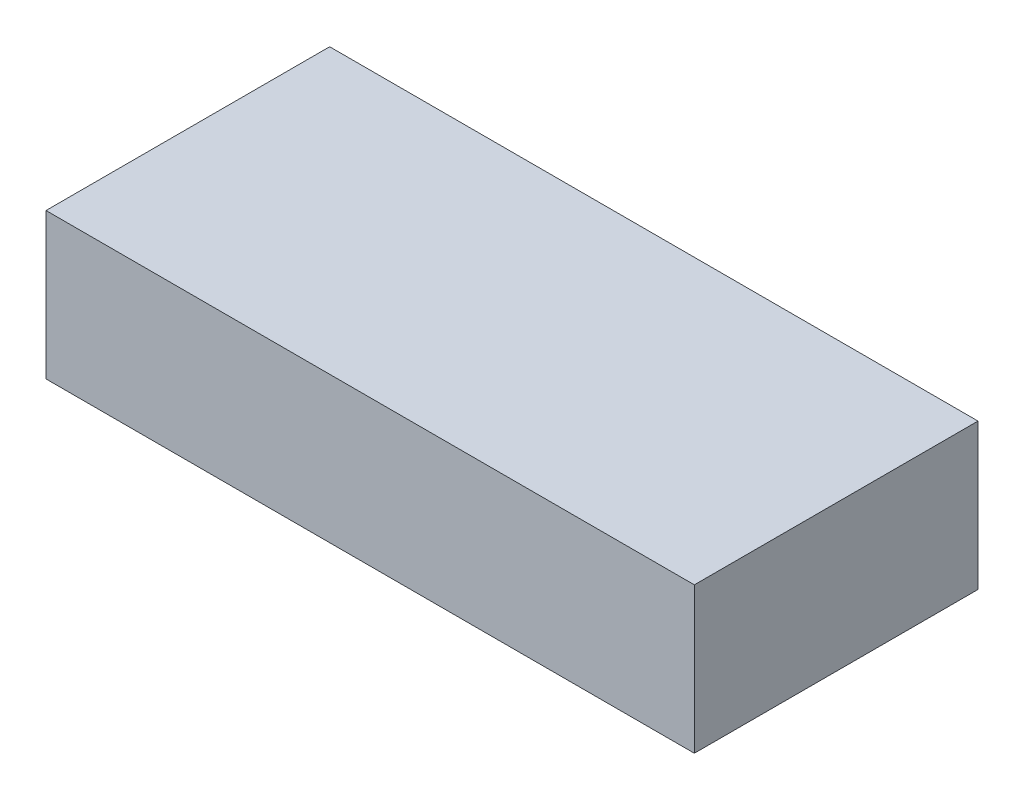
ISO-10303-21;
HEADER;
FILE_DESCRIPTION(('STEP AP214'),'2;1');
FILE_NAME('part.step','',(''),(''),'','','');
FILE_SCHEMA(('AUTOMOTIVE_DESIGN { 1 0 10303 214 1 1 1 1 }'));
ENDSEC;
DATA;
#1=APPLICATION_CONTEXT('core data for automotive mechanical design processes');
#2=APPLICATION_PROTOCOL_DEFINITION('international standard','automotive_design',2000,#1);
#3=PRODUCT_CONTEXT('',#1,'mechanical');
#4=PRODUCT('Part','Part','',(#3));
#5=PRODUCT_RELATED_PRODUCT_CATEGORY('part','',(#4));
#6=PRODUCT_DEFINITION_FORMATION('','',#4);
#7=PRODUCT_DEFINITION_CONTEXT('part definition',#1,'design');
#8=PRODUCT_DEFINITION('design','',#6,#7);
#9=PRODUCT_DEFINITION_SHAPE('','',#8);
#10=(LENGTH_UNIT() NAMED_UNIT(*) SI_UNIT(.MILLI.,.METRE.));
#11=(NAMED_UNIT(*) PLANE_ANGLE_UNIT() SI_UNIT($,.RADIAN.));
#12=(NAMED_UNIT(*) SI_UNIT($,.STERADIAN.) SOLID_ANGLE_UNIT());
#13=UNCERTAINTY_MEASURE_WITH_UNIT(LENGTH_MEASURE(1.E-05),#10,'distance_accuracy_value','');
#14=(GEOMETRIC_REPRESENTATION_CONTEXT(3) GLOBAL_UNCERTAINTY_ASSIGNED_CONTEXT((#13)) GLOBAL_UNIT_ASSIGNED_CONTEXT((#10,
#11,#12)) REPRESENTATION_CONTEXT('',''));
#15=CARTESIAN_POINT('',(0.,0.,0.));
#16=DIRECTION('',(0.,0.,1.));
#17=DIRECTION('',(1.,0.,0.));
#18=AXIS2_PLACEMENT_3D('',#15,#16,#17);
#19=CARTESIAN_POINT('',(-40.,18.,17.5));
#20=DIRECTION('',(1.,0.,0.));
#21=DIRECTION('',(0.,0.,-1.));
#22=AXIS2_PLACEMENT_3D('',#19,#20,#21);
#23=PLANE('',#22);
#24=DIRECTION('',(0.,0.,1.));
#25=VECTOR('',#24,1.);
#26=CARTESIAN_POINT('',(-40.,0.,17.5));
#27=LINE('',#26,#25);
#28=CARTESIAN_POINT('',(-40.,0.,-17.5));
#29=VERTEX_POINT('',#28);
#30=CARTESIAN_POINT('',(-40.,0.,17.5));
#31=VERTEX_POINT('',#30);
#32=EDGE_CURVE('E96',#29,#31,#27,.T.);
#33=ORIENTED_EDGE('',*,*,#32,.T.);
#34=DIRECTION('',(0.,-1.,0.));
#35=VECTOR('',#34,1.);
#36=CARTESIAN_POINT('',(-40.,18.,17.5));
#37=LINE('',#36,#35);
#38=CARTESIAN_POINT('',(-40.,18.,17.5));
#39=VERTEX_POINT('',#38);
#40=EDGE_CURVE('E11',#39,#31,#37,.T.);
#41=ORIENTED_EDGE('',*,*,#40,.F.);
#42=DIRECTION('',(0.,0.,1.));
#43=VECTOR('',#42,1.);
#44=CARTESIAN_POINT('',(-40.,18.,17.5));
#45=LINE('',#44,#43);
#46=CARTESIAN_POINT('',(-40.,18.,-17.5));
#47=VERTEX_POINT('',#46);
#48=EDGE_CURVE('E84',#47,#39,#45,.T.);
#49=ORIENTED_EDGE('',*,*,#48,.F.);
#50=DIRECTION('',(0.,-1.,0.));
#51=VECTOR('',#50,1.);
#52=CARTESIAN_POINT('',(-40.,18.,-17.5));
#53=LINE('',#52,#51);
#54=EDGE_CURVE('E92',#47,#29,#53,.T.);
#55=ORIENTED_EDGE('',*,*,#54,.T.);
#56=EDGE_LOOP('',(#33,#41,#49,#55));
#57=FACE_BOUND('',#56,.T.);
#58=ADVANCED_FACE('F33',(#57),#23,.F.);
#59=CARTESIAN_POINT('',(40.,18.,17.5));
#60=DIRECTION('',(0.,0.,-1.));
#61=DIRECTION('',(-1.,0.,0.));
#62=AXIS2_PLACEMENT_3D('',#59,#60,#61);
#63=PLANE('',#62);
#64=DIRECTION('',(1.,0.,0.));
#65=VECTOR('',#64,1.);
#66=CARTESIAN_POINT('',(40.,0.,17.5));
#67=LINE('',#66,#65);
#68=CARTESIAN_POINT('',(40.,0.,17.5));
#69=VERTEX_POINT('',#68);
#70=EDGE_CURVE('E88',#31,#69,#67,.T.);
#71=ORIENTED_EDGE('',*,*,#70,.T.);
#72=DIRECTION('',(0.,-1.,0.));
#73=VECTOR('',#72,1.);
#74=CARTESIAN_POINT('',(40.,18.,17.5));
#75=LINE('',#74,#73);
#76=CARTESIAN_POINT('',(40.,18.,17.5));
#77=VERTEX_POINT('',#76);
#78=EDGE_CURVE('E41',#77,#69,#75,.T.);
#79=ORIENTED_EDGE('',*,*,#78,.F.);
#80=DIRECTION('',(1.,0.,0.));
#81=VECTOR('',#80,1.);
#82=CARTESIAN_POINT('',(40.,18.,17.5));
#83=LINE('',#82,#81);
#84=EDGE_CURVE('E79',#39,#77,#83,.T.);
#85=ORIENTED_EDGE('',*,*,#84,.F.);
#86=ORIENTED_EDGE('',*,*,#40,.T.);
#87=EDGE_LOOP('',(#71,#79,#85,#86));
#88=FACE_BOUND('',#87,.T.);
#89=ADVANCED_FACE('F87',(#88),#63,.F.);
#90=CARTESIAN_POINT('',(40.,18.,17.5));
#91=DIRECTION('',(-1.,0.,0.));
#92=DIRECTION('',(0.,0.,1.));
#93=AXIS2_PLACEMENT_3D('',#90,#91,#92);
#94=PLANE('',#93);
#95=DIRECTION('',(0.,0.,-1.));
#96=VECTOR('',#95,1.);
#97=CARTESIAN_POINT('',(40.,0.,17.5));
#98=LINE('',#97,#96);
#99=CARTESIAN_POINT('',(40.,0.,-17.5));
#100=VERTEX_POINT('',#99);
#101=EDGE_CURVE('E66',#69,#100,#98,.T.);
#102=ORIENTED_EDGE('',*,*,#101,.T.);
#103=DIRECTION('',(0.,-1.,0.));
#104=VECTOR('',#103,1.);
#105=CARTESIAN_POINT('',(40.,18.,-17.5));
#106=LINE('',#105,#104);
#107=CARTESIAN_POINT('',(40.,18.,-17.5));
#108=VERTEX_POINT('',#107);
#109=EDGE_CURVE('E89',#108,#100,#106,.T.);
#110=ORIENTED_EDGE('',*,*,#109,.F.);
#111=DIRECTION('',(0.,0.,-1.));
#112=VECTOR('',#111,1.);
#113=CARTESIAN_POINT('',(40.,18.,17.5));
#114=LINE('',#113,#112);
#115=EDGE_CURVE('E82',#77,#108,#114,.T.);
#116=ORIENTED_EDGE('',*,*,#115,.F.);
#117=ORIENTED_EDGE('',*,*,#78,.T.);
#118=EDGE_LOOP('',(#102,#110,#116,#117));
#119=FACE_BOUND('',#118,.T.);
#120=ADVANCED_FACE('F90',(#119),#94,.F.);
#121=CARTESIAN_POINT('',(40.,18.,-17.5));
#122=DIRECTION('',(0.,0.,1.));
#123=DIRECTION('',(1.,0.,0.));
#124=AXIS2_PLACEMENT_3D('',#121,#122,#123);
#125=PLANE('',#124);
#126=DIRECTION('',(-1.,0.,0.));
#127=VECTOR('',#126,1.);
#128=CARTESIAN_POINT('',(40.,0.,-17.5));
#129=LINE('',#128,#127);
#130=EDGE_CURVE('E72',#100,#29,#129,.T.);
#131=ORIENTED_EDGE('',*,*,#130,.T.);
#132=ORIENTED_EDGE('',*,*,#54,.F.);
#133=DIRECTION('',(-1.,0.,0.));
#134=VECTOR('',#133,1.);
#135=CARTESIAN_POINT('',(40.,18.,-17.5));
#136=LINE('',#135,#134);
#137=EDGE_CURVE('E49',#108,#47,#136,.T.);
#138=ORIENTED_EDGE('',*,*,#137,.F.);
#139=ORIENTED_EDGE('',*,*,#109,.T.);
#140=EDGE_LOOP('',(#131,#132,#138,#139));
#141=FACE_BOUND('',#140,.T.);
#142=ADVANCED_FACE('F103',(#141),#125,.F.);
#143=CARTESIAN_POINT('',(0.,18.,0.));
#144=DIRECTION('',(0.,1.,0.));
#145=DIRECTION('',(0.,0.,1.));
#146=AXIS2_PLACEMENT_3D('',#143,#144,#145);
#147=PLANE('',#146);
#148=ORIENTED_EDGE('',*,*,#48,.T.);
#149=ORIENTED_EDGE('',*,*,#84,.T.);
#150=ORIENTED_EDGE('',*,*,#115,.T.);
#151=ORIENTED_EDGE('',*,*,#137,.T.);
#152=EDGE_LOOP('',(#148,#149,#150,#151));
#153=FACE_BOUND('',#152,.T.);
#154=ADVANCED_FACE('F80',(#153),#147,.T.);
#155=CARTESIAN_POINT('',(0.,0.,0.));
#156=DIRECTION('',(0.,1.,0.));
#157=DIRECTION('',(0.,0.,1.));
#158=AXIS2_PLACEMENT_3D('',#155,#156,#157);
#159=PLANE('',#158);
#160=ORIENTED_EDGE('',*,*,#32,.F.);
#161=ORIENTED_EDGE('',*,*,#130,.F.);
#162=ORIENTED_EDGE('',*,*,#101,.F.);
#163=ORIENTED_EDGE('',*,*,#70,.F.);
#164=EDGE_LOOP('',(#160,#161,#162,#163));
#165=FACE_BOUND('',#164,.T.);
#166=ADVANCED_FACE('F106',(#165),#159,.F.);
#167=CLOSED_SHELL('',(#58,#89,#120,#142,#154,#166));
#168=MANIFOLD_SOLID_BREP('B2',#167);
#169=ADVANCED_BREP_SHAPE_REPRESENTATION('',(#18,#168),#14);
#170=SHAPE_DEFINITION_REPRESENTATION(#9,#169);
ENDSEC;
END-ISO-10303-21;
